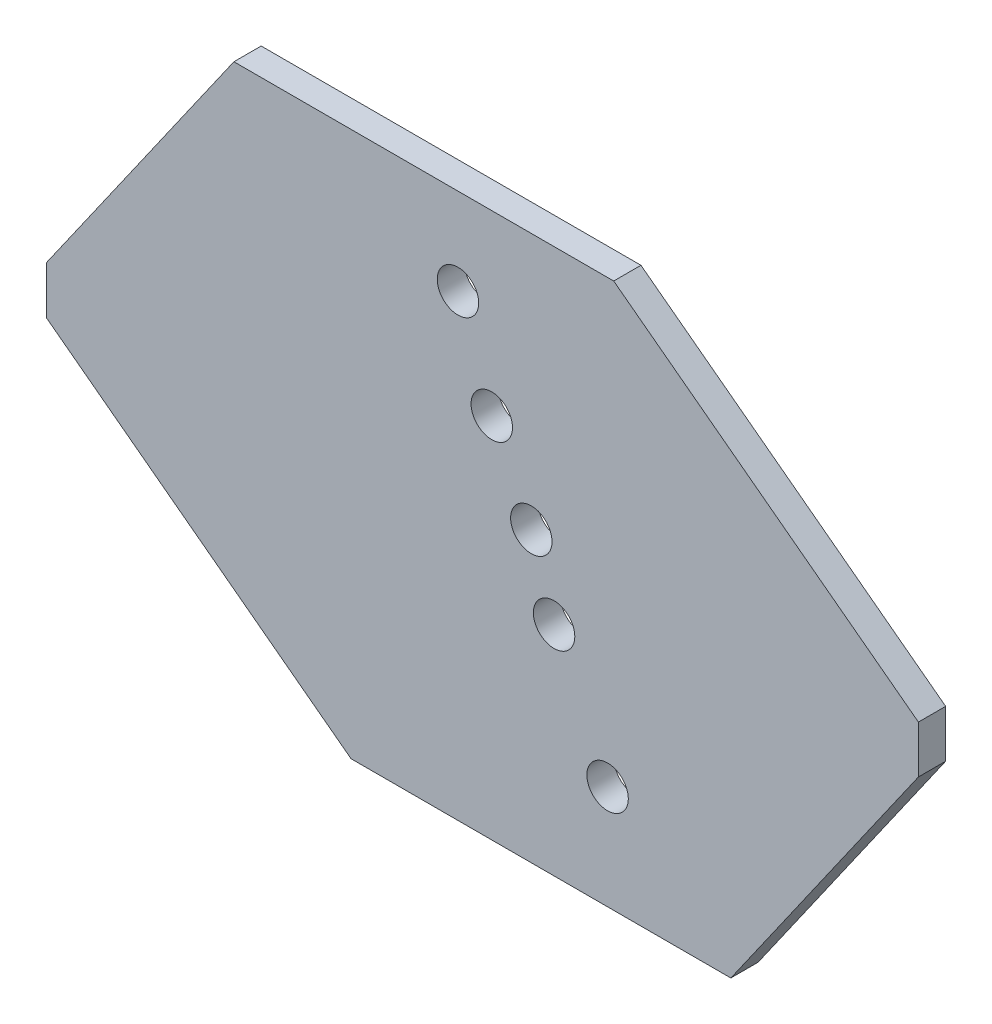
ISO-10303-21;
HEADER;
FILE_DESCRIPTION(('STEP AP214'),'2;1');
FILE_NAME('part.step','',(''),(''),'','','');
FILE_SCHEMA(('AUTOMOTIVE_DESIGN { 1 0 10303 214 1 1 1 1 }'));
ENDSEC;
DATA;
#1=APPLICATION_CONTEXT('core data for automotive mechanical design processes');
#2=APPLICATION_PROTOCOL_DEFINITION('international standard','automotive_design',2000,#1);
#3=PRODUCT_CONTEXT('',#1,'mechanical');
#4=PRODUCT('Part','Part','',(#3));
#5=PRODUCT_RELATED_PRODUCT_CATEGORY('part','',(#4));
#6=PRODUCT_DEFINITION_FORMATION('','',#4);
#7=PRODUCT_DEFINITION_CONTEXT('part definition',#1,'design');
#8=PRODUCT_DEFINITION('design','',#6,#7);
#9=PRODUCT_DEFINITION_SHAPE('','',#8);
#10=(LENGTH_UNIT() NAMED_UNIT(*) SI_UNIT(.MILLI.,.METRE.));
#11=(NAMED_UNIT(*) PLANE_ANGLE_UNIT() SI_UNIT($,.RADIAN.));
#12=(NAMED_UNIT(*) SI_UNIT($,.STERADIAN.) SOLID_ANGLE_UNIT());
#13=UNCERTAINTY_MEASURE_WITH_UNIT(LENGTH_MEASURE(1.E-05),#10,'distance_accuracy_value','');
#14=(GEOMETRIC_REPRESENTATION_CONTEXT(3) GLOBAL_UNCERTAINTY_ASSIGNED_CONTEXT((#13)) GLOBAL_UNIT_ASSIGNED_CONTEXT((#10,
#11,#12)) REPRESENTATION_CONTEXT('',''));
#15=CARTESIAN_POINT('',(0.,0.,0.));
#16=DIRECTION('',(0.,0.,1.));
#17=DIRECTION('',(1.,0.,0.));
#18=AXIS2_PLACEMENT_3D('',#15,#16,#17);
#19=CARTESIAN_POINT('',(0.,0.,3.175));
#20=DIRECTION('',(1.,0.,0.));
#21=DIRECTION('',(0.,1.,0.));
#22=AXIS2_PLACEMENT_3D('',#19,#20,#21);
#23=PLANE('',#22);
#24=DIRECTION('',(0.,-1.,0.));
#25=VECTOR('',#24,1.);
#26=CARTESIAN_POINT('',(0.,0.,3.175));
#27=LINE('',#26,#25);
#28=CARTESIAN_POINT('',(0.,32.2903071125895,3.175));
#29=VERTEX_POINT('',#28);
#30=CARTESIAN_POINT('',(0.,26.7506777791084,3.175));
#31=VERTEX_POINT('',#30);
#32=EDGE_CURVE('E120',#29,#31,#27,.T.);
#33=ORIENTED_EDGE('',*,*,#32,.F.);
#34=DIRECTION('',(0.,0.,1.));
#35=VECTOR('',#34,1.);
#36=CARTESIAN_POINT('',(0.,32.2903071125895,0.));
#37=LINE('',#36,#35);
#38=CARTESIAN_POINT('',(0.,32.2903071125895,0.));
#39=VERTEX_POINT('',#38);
#40=EDGE_CURVE('E106',#39,#29,#37,.T.);
#41=ORIENTED_EDGE('',*,*,#40,.F.);
#42=DIRECTION('',(0.,-1.,0.));
#43=VECTOR('',#42,1.);
#44=CARTESIAN_POINT('',(0.,0.,0.));
#45=LINE('',#44,#43);
#46=CARTESIAN_POINT('',(0.,26.7506777791083,0.));
#47=VERTEX_POINT('',#46);
#48=EDGE_CURVE('E118',#39,#47,#45,.T.);
#49=ORIENTED_EDGE('',*,*,#48,.T.);
#50=DIRECTION('',(0.,0.,1.));
#51=VECTOR('',#50,1.);
#52=CARTESIAN_POINT('',(0.,26.7506777791084,0.));
#53=LINE('',#52,#51);
#54=EDGE_CURVE('E64',#47,#31,#53,.T.);
#55=ORIENTED_EDGE('',*,*,#54,.T.);
#56=EDGE_LOOP('',(#33,#41,#49,#55));
#57=FACE_BOUND('',#56,.T.);
#58=ADVANCED_FACE('F39',(#57),#23,.F.);
#59=CARTESIAN_POINT('',(0.,0.,3.175));
#60=DIRECTION('',(0.,1.,0.));
#61=DIRECTION('',(0.,0.,1.));
#62=AXIS2_PLACEMENT_3D('',#59,#60,#61);
#63=PLANE('',#62);
#64=DIRECTION('',(1.,0.,0.));
#65=VECTOR('',#64,1.);
#66=CARTESIAN_POINT('',(0.,0.,3.175));
#67=LINE('',#66,#65);
#68=CARTESIAN_POINT('',(35.4993484216023,0.,3.175));
#69=VERTEX_POINT('',#68);
#70=CARTESIAN_POINT('',(79.746737775025,0.,3.175));
#71=VERTEX_POINT('',#70);
#72=EDGE_CURVE('E148',#69,#71,#67,.T.);
#73=ORIENTED_EDGE('',*,*,#72,.F.);
#74=DIRECTION('',(0.,0.,1.));
#75=VECTOR('',#74,1.);
#76=CARTESIAN_POINT('',(35.4993484216023,0.,0.));
#77=LINE('',#76,#75);
#78=CARTESIAN_POINT('',(35.4993484216023,0.,0.));
#79=VERTEX_POINT('',#78);
#80=EDGE_CURVE('E187',#79,#69,#77,.T.);
#81=ORIENTED_EDGE('',*,*,#80,.F.);
#82=DIRECTION('',(1.,0.,0.));
#83=VECTOR('',#82,1.);
#84=CARTESIAN_POINT('',(0.,0.,0.));
#85=LINE('',#84,#83);
#86=CARTESIAN_POINT('',(79.746737775025,0.,0.));
#87=VERTEX_POINT('',#86);
#88=EDGE_CURVE('E127',#79,#87,#85,.T.);
#89=ORIENTED_EDGE('',*,*,#88,.T.);
#90=DIRECTION('',(0.,0.,1.));
#91=VECTOR('',#90,1.);
#92=CARTESIAN_POINT('',(79.746737775025,0.,0.));
#93=LINE('',#92,#91);
#94=EDGE_CURVE('E128',#87,#71,#93,.T.);
#95=ORIENTED_EDGE('',*,*,#94,.T.);
#96=EDGE_LOOP('',(#73,#81,#89,#95));
#97=FACE_BOUND('',#96,.T.);
#98=ADVANCED_FACE('F280',(#97),#63,.F.);
#99=CARTESIAN_POINT('',(101.6,0.,3.175));
#100=DIRECTION('',(-1.,0.,0.));
#101=DIRECTION('',(0.,-1.,0.));
#102=AXIS2_PLACEMENT_3D('',#99,#100,#101);
#103=PLANE('',#102);
#104=DIRECTION('',(0.,1.,0.));
#105=VECTOR('',#104,1.);
#106=CARTESIAN_POINT('',(101.6,0.,3.175));
#107=LINE('',#106,#105);
#108=CARTESIAN_POINT('',(101.6,31.2096928874105,3.175));
#109=VERTEX_POINT('',#108);
#110=CARTESIAN_POINT('',(101.6,36.7493222208917,3.175));
#111=VERTEX_POINT('',#110);
#112=EDGE_CURVE('E48',#109,#111,#107,.T.);
#113=ORIENTED_EDGE('',*,*,#112,.F.);
#114=DIRECTION('',(0.,0.,1.));
#115=VECTOR('',#114,1.);
#116=CARTESIAN_POINT('',(101.6,31.2096928874105,0.));
#117=LINE('',#116,#115);
#118=CARTESIAN_POINT('',(101.6,31.2096928874105,0.));
#119=VERTEX_POINT('',#118);
#120=EDGE_CURVE('E135',#119,#109,#117,.T.);
#121=ORIENTED_EDGE('',*,*,#120,.F.);
#122=DIRECTION('',(0.,1.,0.));
#123=VECTOR('',#122,1.);
#124=CARTESIAN_POINT('',(101.6,0.,0.));
#125=LINE('',#124,#123);
#126=CARTESIAN_POINT('',(101.6,36.7493222208916,0.));
#127=VERTEX_POINT('',#126);
#128=EDGE_CURVE('E132',#119,#127,#125,.T.);
#129=ORIENTED_EDGE('',*,*,#128,.T.);
#130=DIRECTION('',(0.,0.,1.));
#131=VECTOR('',#130,1.);
#132=CARTESIAN_POINT('',(101.6,36.7493222208917,0.));
#133=LINE('',#132,#131);
#134=EDGE_CURVE('E168',#127,#111,#133,.T.);
#135=ORIENTED_EDGE('',*,*,#134,.T.);
#136=EDGE_LOOP('',(#113,#121,#129,#135));
#137=FACE_BOUND('',#136,.T.);
#138=ADVANCED_FACE('F167',(#137),#103,.F.);
#139=CARTESIAN_POINT('',(0.,63.5,3.175));
#140=DIRECTION('',(0.,-1.,0.));
#141=DIRECTION('',(0.,0.,-1.));
#142=AXIS2_PLACEMENT_3D('',#139,#140,#141);
#143=PLANE('',#142);
#144=DIRECTION('',(-1.,0.,0.));
#145=VECTOR('',#144,1.);
#146=CARTESIAN_POINT('',(0.,63.5,0.));
#147=LINE('',#146,#145);
#148=CARTESIAN_POINT('',(66.1006515783977,63.5,0.));
#149=VERTEX_POINT('',#148);
#150=CARTESIAN_POINT('',(21.853262224975,63.5,0.));
#151=VERTEX_POINT('',#150);
#152=EDGE_CURVE('E42',#149,#151,#147,.T.);
#153=ORIENTED_EDGE('',*,*,#152,.T.);
#154=DIRECTION('',(0.,0.,1.));
#155=VECTOR('',#154,1.);
#156=CARTESIAN_POINT('',(21.853262224975,63.5,0.));
#157=LINE('',#156,#155);
#158=CARTESIAN_POINT('',(21.853262224975,63.5,3.175));
#159=VERTEX_POINT('',#158);
#160=EDGE_CURVE('E56',#151,#159,#157,.T.);
#161=ORIENTED_EDGE('',*,*,#160,.T.);
#162=DIRECTION('',(-1.,0.,0.));
#163=VECTOR('',#162,1.);
#164=CARTESIAN_POINT('',(0.,63.5,3.175));
#165=LINE('',#164,#163);
#166=CARTESIAN_POINT('',(66.1006515783977,63.5,3.175));
#167=VERTEX_POINT('',#166);
#168=EDGE_CURVE('E11',#167,#159,#165,.T.);
#169=ORIENTED_EDGE('',*,*,#168,.F.);
#170=DIRECTION('',(0.,0.,1.));
#171=VECTOR('',#170,1.);
#172=CARTESIAN_POINT('',(66.1006515783977,63.5,0.));
#173=LINE('',#172,#171);
#174=EDGE_CURVE('E155',#149,#167,#173,.T.);
#175=ORIENTED_EDGE('',*,*,#174,.F.);
#176=EDGE_LOOP('',(#153,#161,#169,#175));
#177=FACE_BOUND('',#176,.T.);
#178=ADVANCED_FACE('F253',(#177),#143,.F.);
#179=CARTESIAN_POINT('',(0.,0.,3.175));
#180=DIRECTION('',(0.,0.,-1.));
#181=DIRECTION('',(-1.,0.,0.));
#182=AXIS2_PLACEMENT_3D('',#179,#180,#181);
#183=PLANE('',#182);
#184=CARTESIAN_POINT('',(47.9581196331935,53.4039970630147,3.175));
#185=DIRECTION('',(0.,0.,1.));
#186=DIRECTION('',(1.,0.,0.));
#187=AXIS2_PLACEMENT_3D('',#184,#185,#186);
#188=CIRCLE('',#187,2.41299999999999);
#189=CARTESIAN_POINT('',(50.3711196331935,53.4039970630147,3.175));
#190=VERTEX_POINT('',#189);
#191=EDGE_CURVE('E219',#190,#190,#188,.T.);
#192=ORIENTED_EDGE('',*,*,#191,.F.);
#193=EDGE_LOOP('',(#192));
#194=FACE_BOUND('',#193,.T.);
#195=CARTESIAN_POINT('',(56.5030567744316,33.6006579480816,3.175));
#196=DIRECTION('',(0.,0.,1.));
#197=DIRECTION('',(1.,0.,0.));
#198=AXIS2_PLACEMENT_3D('',#195,#196,#197);
#199=CIRCLE('',#198,2.41299999999999);
#200=CARTESIAN_POINT('',(58.9160567744316,33.6006579480816,3.175));
#201=VERTEX_POINT('',#200);
#202=EDGE_CURVE('E220',#201,#201,#199,.T.);
#203=ORIENTED_EDGE('',*,*,#202,.F.);
#204=EDGE_LOOP('',(#203));
#205=FACE_BOUND('',#204,.T.);
#206=CARTESIAN_POINT('',(65.3894645206776,12.1029171199325,3.175));
#207=DIRECTION('',(0.,0.,1.));
#208=DIRECTION('',(1.,0.,0.));
#209=AXIS2_PLACEMENT_3D('',#206,#207,#208);
#210=CIRCLE('',#209,2.41299999999999);
#211=CARTESIAN_POINT('',(67.8024645206776,12.1029171199325,3.175));
#212=VERTEX_POINT('',#211);
#213=EDGE_CURVE('E228',#212,#212,#210,.T.);
#214=ORIENTED_EDGE('',*,*,#213,.F.);
#215=EDGE_LOOP('',(#214));
#216=FACE_BOUND('',#215,.T.);
#217=CARTESIAN_POINT('',(59.1549073226361,25.3604001180463,3.175));
#218=DIRECTION('',(0.,0.,1.));
#219=DIRECTION('',(1.,0.,0.));
#220=AXIS2_PLACEMENT_3D('',#217,#218,#219);
#221=CIRCLE('',#220,2.413);
#222=CARTESIAN_POINT('',(61.5679073226361,25.3604001180463,3.175));
#223=VERTEX_POINT('',#222);
#224=EDGE_CURVE('E202',#223,#223,#221,.T.);
#225=ORIENTED_EDGE('',*,*,#224,.F.);
#226=EDGE_LOOP('',(#225));
#227=FACE_BOUND('',#226,.T.);
#228=CARTESIAN_POINT('',(51.8945567862659,42.8027955424,3.175));
#229=DIRECTION('',(0.,0.,1.));
#230=DIRECTION('',(1.,0.,0.));
#231=AXIS2_PLACEMENT_3D('',#228,#229,#230);
#232=CIRCLE('',#231,2.41299999999999);
#233=CARTESIAN_POINT('',(54.3075567862659,42.8027955424,3.175));
#234=VERTEX_POINT('',#233);
#235=EDGE_CURVE('E211',#234,#234,#232,.T.);
#236=ORIENTED_EDGE('',*,*,#235,.F.);
#237=EDGE_LOOP('',(#236));
#238=FACE_BOUND('',#237,.T.);
#239=ORIENTED_EDGE('',*,*,#168,.T.);
#240=DIRECTION('',(0.57357643635105,0.819152044288989,0.));
#241=VECTOR('',#240,1.);
#242=CARTESIAN_POINT('',(21.853262224975,63.5,3.175));
#243=LINE('',#242,#241);
#244=EDGE_CURVE('E113',#29,#159,#243,.T.);
#245=ORIENTED_EDGE('',*,*,#244,.F.);
#246=ORIENTED_EDGE('',*,*,#32,.T.);
#247=DIRECTION('',(-0.798635510047296,0.601815023152044,0.));
#248=VECTOR('',#247,1.);
#249=CARTESIAN_POINT('',(0.,26.7506777791084,3.175));
#250=LINE('',#249,#248);
#251=EDGE_CURVE('E192',#69,#31,#250,.T.);
#252=ORIENTED_EDGE('',*,*,#251,.F.);
#253=ORIENTED_EDGE('',*,*,#72,.T.);
#254=DIRECTION('',(-0.57357643635105,-0.819152044288989,0.));
#255=VECTOR('',#254,1.);
#256=CARTESIAN_POINT('',(101.6,31.2096928874105,3.175));
#257=LINE('',#256,#255);
#258=EDGE_CURVE('E166',#109,#71,#257,.T.);
#259=ORIENTED_EDGE('',*,*,#258,.F.);
#260=ORIENTED_EDGE('',*,*,#112,.T.);
#261=DIRECTION('',(0.798635510047296,-0.601815023152043,0.));
#262=VECTOR('',#261,1.);
#263=CARTESIAN_POINT('',(101.6,36.7493222208917,3.175));
#264=LINE('',#263,#262);
#265=EDGE_CURVE('E163',#167,#111,#264,.T.);
#266=ORIENTED_EDGE('',*,*,#265,.F.);
#267=EDGE_LOOP('',(#239,#245,#246,#252,#253,#259,#260,#266));
#268=FACE_BOUND('',#267,.T.);
#269=ADVANCED_FACE('F162',(#194,#205,#216,#227,#238,#268),#183,.F.);
#270=CARTESIAN_POINT('',(0.,0.,0.));
#271=DIRECTION('',(0.,0.,-1.));
#272=DIRECTION('',(-1.,0.,0.));
#273=AXIS2_PLACEMENT_3D('',#270,#271,#272);
#274=PLANE('',#273);
#275=CARTESIAN_POINT('',(47.9581196331935,53.4039970630147,0.));
#276=DIRECTION('',(0.,0.,1.));
#277=DIRECTION('',(1.,0.,0.));
#278=AXIS2_PLACEMENT_3D('',#275,#276,#277);
#279=CIRCLE('',#278,2.41299999999999);
#280=CARTESIAN_POINT('',(50.3711196331935,53.4039970630147,0.));
#281=VERTEX_POINT('',#280);
#282=EDGE_CURVE('E195',#281,#281,#279,.T.);
#283=ORIENTED_EDGE('',*,*,#282,.T.);
#284=EDGE_LOOP('',(#283));
#285=FACE_BOUND('',#284,.T.);
#286=CARTESIAN_POINT('',(56.5030567744316,33.6006579480816,0.));
#287=DIRECTION('',(0.,0.,1.));
#288=DIRECTION('',(1.,0.,0.));
#289=AXIS2_PLACEMENT_3D('',#286,#287,#288);
#290=CIRCLE('',#289,2.41299999999999);
#291=CARTESIAN_POINT('',(58.9160567744316,33.6006579480816,0.));
#292=VERTEX_POINT('',#291);
#293=EDGE_CURVE('E224',#292,#292,#290,.T.);
#294=ORIENTED_EDGE('',*,*,#293,.T.);
#295=EDGE_LOOP('',(#294));
#296=FACE_BOUND('',#295,.T.);
#297=CARTESIAN_POINT('',(65.3894645206776,12.1029171199325,0.));
#298=DIRECTION('',(0.,0.,1.));
#299=DIRECTION('',(1.,0.,0.));
#300=AXIS2_PLACEMENT_3D('',#297,#298,#299);
#301=CIRCLE('',#300,2.41299999999999);
#302=CARTESIAN_POINT('',(67.8024645206776,12.1029171199325,0.));
#303=VERTEX_POINT('',#302);
#304=EDGE_CURVE('E207',#303,#303,#301,.T.);
#305=ORIENTED_EDGE('',*,*,#304,.T.);
#306=EDGE_LOOP('',(#305));
#307=FACE_BOUND('',#306,.T.);
#308=CARTESIAN_POINT('',(59.1549073226361,25.3604001180463,0.));
#309=DIRECTION('',(0.,0.,1.));
#310=DIRECTION('',(1.,0.,0.));
#311=AXIS2_PLACEMENT_3D('',#308,#309,#310);
#312=CIRCLE('',#311,2.413);
#313=CARTESIAN_POINT('',(61.5679073226361,25.3604001180463,0.));
#314=VERTEX_POINT('',#313);
#315=EDGE_CURVE('E206',#314,#314,#312,.T.);
#316=ORIENTED_EDGE('',*,*,#315,.T.);
#317=EDGE_LOOP('',(#316));
#318=FACE_BOUND('',#317,.T.);
#319=CARTESIAN_POINT('',(51.8945567862659,42.8027955424,0.));
#320=DIRECTION('',(0.,0.,1.));
#321=DIRECTION('',(1.,0.,0.));
#322=AXIS2_PLACEMENT_3D('',#319,#320,#321);
#323=CIRCLE('',#322,2.41299999999999);
#324=CARTESIAN_POINT('',(54.3075567862659,42.8027955424,0.));
#325=VERTEX_POINT('',#324);
#326=EDGE_CURVE('E215',#325,#325,#323,.T.);
#327=ORIENTED_EDGE('',*,*,#326,.T.);
#328=EDGE_LOOP('',(#327));
#329=FACE_BOUND('',#328,.T.);
#330=DIRECTION('',(0.57357643635105,0.819152044288989,0.));
#331=VECTOR('',#330,1.);
#332=CARTESIAN_POINT('',(21.853262224975,63.5,0.));
#333=LINE('',#332,#331);
#334=EDGE_CURVE('E103',#39,#151,#333,.T.);
#335=ORIENTED_EDGE('',*,*,#334,.T.);
#336=ORIENTED_EDGE('',*,*,#152,.F.);
#337=DIRECTION('',(0.798635510047296,-0.601815023152043,0.));
#338=VECTOR('',#337,1.);
#339=CARTESIAN_POINT('',(101.6,36.7493222208917,0.));
#340=LINE('',#339,#338);
#341=EDGE_CURVE('E176',#149,#127,#340,.T.);
#342=ORIENTED_EDGE('',*,*,#341,.T.);
#343=ORIENTED_EDGE('',*,*,#128,.F.);
#344=DIRECTION('',(-0.57357643635105,-0.819152044288989,0.));
#345=VECTOR('',#344,1.);
#346=CARTESIAN_POINT('',(101.6,31.2096928874105,0.));
#347=LINE('',#346,#345);
#348=EDGE_CURVE('E174',#119,#87,#347,.T.);
#349=ORIENTED_EDGE('',*,*,#348,.T.);
#350=ORIENTED_EDGE('',*,*,#88,.F.);
#351=DIRECTION('',(-0.798635510047296,0.601815023152044,0.));
#352=VECTOR('',#351,1.);
#353=CARTESIAN_POINT('',(0.,26.7506777791084,0.));
#354=LINE('',#353,#352);
#355=EDGE_CURVE('E125',#79,#47,#354,.T.);
#356=ORIENTED_EDGE('',*,*,#355,.T.);
#357=ORIENTED_EDGE('',*,*,#48,.F.);
#358=EDGE_LOOP('',(#335,#336,#342,#343,#349,#350,#356,#357));
#359=FACE_BOUND('',#358,.T.);
#360=ADVANCED_FACE('F123',(#285,#296,#307,#318,#329,#359),#274,.T.);
#361=CARTESIAN_POINT('',(101.6,36.7493222208917,0.));
#362=DIRECTION('',(-0.601815023152043,-0.798635510047296,0.));
#363=DIRECTION('',(0.798635510047297,-0.601815023152044,0.));
#364=AXIS2_PLACEMENT_3D('',#361,#362,#363);
#365=PLANE('',#364);
#366=ORIENTED_EDGE('',*,*,#265,.T.);
#367=ORIENTED_EDGE('',*,*,#134,.F.);
#368=ORIENTED_EDGE('',*,*,#341,.F.);
#369=ORIENTED_EDGE('',*,*,#174,.T.);
#370=EDGE_LOOP('',(#366,#367,#368,#369));
#371=FACE_BOUND('',#370,.T.);
#372=ADVANCED_FACE('F294',(#371),#365,.F.);
#373=CARTESIAN_POINT('',(101.6,31.2096928874105,0.));
#374=DIRECTION('',(-0.819152044288989,0.57357643635105,0.));
#375=DIRECTION('',(-0.57357643635105,-0.819152044288989,0.));
#376=AXIS2_PLACEMENT_3D('',#373,#374,#375);
#377=PLANE('',#376);
#378=ORIENTED_EDGE('',*,*,#258,.T.);
#379=ORIENTED_EDGE('',*,*,#94,.F.);
#380=ORIENTED_EDGE('',*,*,#348,.F.);
#381=ORIENTED_EDGE('',*,*,#120,.T.);
#382=EDGE_LOOP('',(#378,#379,#380,#381));
#383=FACE_BOUND('',#382,.T.);
#384=ADVANCED_FACE('F298',(#383),#377,.F.);
#385=CARTESIAN_POINT('',(0.,26.7506777791084,0.));
#386=DIRECTION('',(0.601815023152044,0.798635510047296,0.));
#387=DIRECTION('',(-0.798635510047296,0.601815023152044,0.));
#388=AXIS2_PLACEMENT_3D('',#385,#386,#387);
#389=PLANE('',#388);
#390=ORIENTED_EDGE('',*,*,#251,.T.);
#391=ORIENTED_EDGE('',*,*,#54,.F.);
#392=ORIENTED_EDGE('',*,*,#355,.F.);
#393=ORIENTED_EDGE('',*,*,#80,.T.);
#394=EDGE_LOOP('',(#390,#391,#392,#393));
#395=FACE_BOUND('',#394,.T.);
#396=ADVANCED_FACE('F275',(#395),#389,.F.);
#397=CARTESIAN_POINT('',(21.853262224975,63.5,0.));
#398=DIRECTION('',(0.819152044288989,-0.57357643635105,0.));
#399=DIRECTION('',(0.57357643635105,0.819152044288989,0.));
#400=AXIS2_PLACEMENT_3D('',#397,#398,#399);
#401=PLANE('',#400);
#402=ORIENTED_EDGE('',*,*,#244,.T.);
#403=ORIENTED_EDGE('',*,*,#160,.F.);
#404=ORIENTED_EDGE('',*,*,#334,.F.);
#405=ORIENTED_EDGE('',*,*,#40,.T.);
#406=EDGE_LOOP('',(#402,#403,#404,#405));
#407=FACE_BOUND('',#406,.T.);
#408=ADVANCED_FACE('F105',(#407),#401,.F.);
#409=CARTESIAN_POINT('',(51.8945567862659,42.8027955424,0.));
#410=DIRECTION('',(0.,0.,1.));
#411=DIRECTION('',(1.,0.,0.));
#412=AXIS2_PLACEMENT_3D('',#409,#410,#411);
#413=CYLINDRICAL_SURFACE('',#412,2.41299999999999);
#414=ORIENTED_EDGE('',*,*,#326,.F.);
#415=EDGE_LOOP('',(#414));
#416=FACE_BOUND('',#415,.T.);
#417=ORIENTED_EDGE('',*,*,#235,.T.);
#418=EDGE_LOOP('',(#417));
#419=FACE_BOUND('',#418,.T.);
#420=ADVANCED_FACE('F263',(#416,#419),#413,.F.);
#421=CARTESIAN_POINT('',(59.1549073226361,25.3604001180463,0.));
#422=DIRECTION('',(0.,0.,1.));
#423=DIRECTION('',(1.,0.,0.));
#424=AXIS2_PLACEMENT_3D('',#421,#422,#423);
#425=CYLINDRICAL_SURFACE('',#424,2.413);
#426=ORIENTED_EDGE('',*,*,#315,.F.);
#427=EDGE_LOOP('',(#426));
#428=FACE_BOUND('',#427,.T.);
#429=ORIENTED_EDGE('',*,*,#224,.T.);
#430=EDGE_LOOP('',(#429));
#431=FACE_BOUND('',#430,.T.);
#432=ADVANCED_FACE('F265',(#428,#431),#425,.F.);
#433=CARTESIAN_POINT('',(65.3894645206776,12.1029171199325,0.));
#434=DIRECTION('',(0.,0.,1.));
#435=DIRECTION('',(1.,0.,0.));
#436=AXIS2_PLACEMENT_3D('',#433,#434,#435);
#437=CYLINDRICAL_SURFACE('',#436,2.41299999999999);
#438=ORIENTED_EDGE('',*,*,#304,.F.);
#439=EDGE_LOOP('',(#438));
#440=FACE_BOUND('',#439,.T.);
#441=ORIENTED_EDGE('',*,*,#213,.T.);
#442=EDGE_LOOP('',(#441));
#443=FACE_BOUND('',#442,.T.);
#444=ADVANCED_FACE('F272',(#440,#443),#437,.F.);
#445=CARTESIAN_POINT('',(56.5030567744316,33.6006579480816,0.));
#446=DIRECTION('',(0.,0.,1.));
#447=DIRECTION('',(1.,0.,0.));
#448=AXIS2_PLACEMENT_3D('',#445,#446,#447);
#449=CYLINDRICAL_SURFACE('',#448,2.41299999999999);
#450=ORIENTED_EDGE('',*,*,#293,.F.);
#451=EDGE_LOOP('',(#450));
#452=FACE_BOUND('',#451,.T.);
#453=ORIENTED_EDGE('',*,*,#202,.T.);
#454=EDGE_LOOP('',(#453));
#455=FACE_BOUND('',#454,.T.);
#456=ADVANCED_FACE('F247',(#452,#455),#449,.F.);
#457=CARTESIAN_POINT('',(47.9581196331935,53.4039970630147,0.));
#458=DIRECTION('',(0.,0.,1.));
#459=DIRECTION('',(1.,0.,0.));
#460=AXIS2_PLACEMENT_3D('',#457,#458,#459);
#461=CYLINDRICAL_SURFACE('',#460,2.41299999999999);
#462=ORIENTED_EDGE('',*,*,#282,.F.);
#463=EDGE_LOOP('',(#462));
#464=FACE_BOUND('',#463,.T.);
#465=ORIENTED_EDGE('',*,*,#191,.T.);
#466=EDGE_LOOP('',(#465));
#467=FACE_BOUND('',#466,.T.);
#468=ADVANCED_FACE('F244',(#464,#467),#461,.F.);
#469=CLOSED_SHELL('',(#58,#98,#138,#178,#269,#360,#372,#384,#396,#408,#420,#432,#444,#456,#468));
#470=MANIFOLD_SOLID_BREP('B2',#469);
#471=ADVANCED_BREP_SHAPE_REPRESENTATION('',(#18,#470),#14);
#472=SHAPE_DEFINITION_REPRESENTATION(#9,#471);
ENDSEC;
END-ISO-10303-21;
